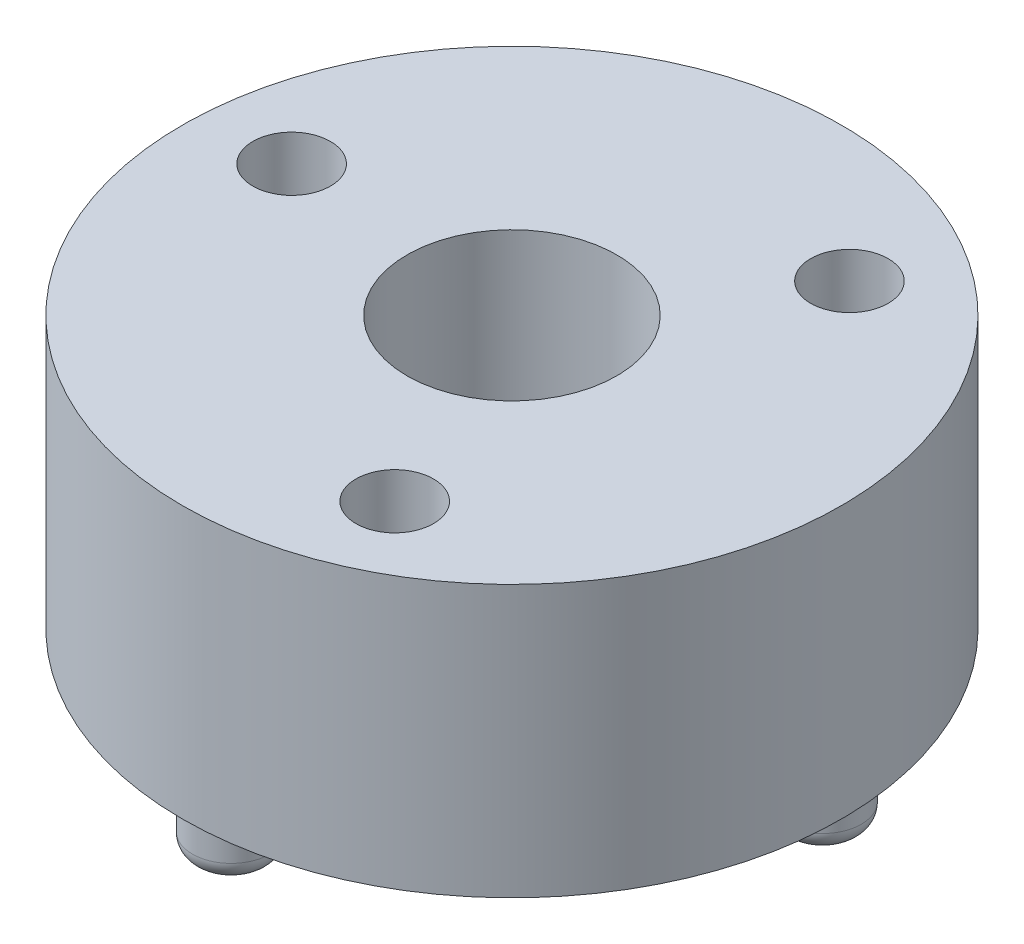
ISO-10303-21;
HEADER;
FILE_DESCRIPTION(('STEP AP214'),'2;1');
FILE_NAME('part.step','',(''),(''),'','','');
FILE_SCHEMA(('AUTOMOTIVE_DESIGN { 1 0 10303 214 1 1 1 1 }'));
ENDSEC;
DATA;
#1=APPLICATION_CONTEXT('core data for automotive mechanical design processes');
#2=APPLICATION_PROTOCOL_DEFINITION('international standard','automotive_design',2000,#1);
#3=PRODUCT_CONTEXT('',#1,'mechanical');
#4=PRODUCT('Part','Part','',(#3));
#5=PRODUCT_RELATED_PRODUCT_CATEGORY('part','',(#4));
#6=PRODUCT_DEFINITION_FORMATION('','',#4);
#7=PRODUCT_DEFINITION_CONTEXT('part definition',#1,'design');
#8=PRODUCT_DEFINITION('design','',#6,#7);
#9=PRODUCT_DEFINITION_SHAPE('','',#8);
#10=(LENGTH_UNIT() NAMED_UNIT(*) SI_UNIT(.MILLI.,.METRE.));
#11=(NAMED_UNIT(*) PLANE_ANGLE_UNIT() SI_UNIT($,.RADIAN.));
#12=(NAMED_UNIT(*) SI_UNIT($,.STERADIAN.) SOLID_ANGLE_UNIT());
#13=UNCERTAINTY_MEASURE_WITH_UNIT(LENGTH_MEASURE(1.E-05),#10,'distance_accuracy_value','');
#14=(GEOMETRIC_REPRESENTATION_CONTEXT(3) GLOBAL_UNCERTAINTY_ASSIGNED_CONTEXT((#13)) GLOBAL_UNIT_ASSIGNED_CONTEXT((#10,
#11,#12)) REPRESENTATION_CONTEXT('',''));
#15=CARTESIAN_POINT('',(0.,0.,0.));
#16=DIRECTION('',(0.,0.,1.));
#17=DIRECTION('',(1.,0.,0.));
#18=AXIS2_PLACEMENT_3D('',#15,#16,#17);
#19=CARTESIAN_POINT('',(0.,7.,0.));
#20=DIRECTION('',(0.,-1.,0.));
#21=DIRECTION('',(0.,0.,-1.));
#22=AXIS2_PLACEMENT_3D('',#19,#20,#21);
#23=CYLINDRICAL_SURFACE('',#22,8.5);
#24=CARTESIAN_POINT('',(0.,7.,0.));
#25=DIRECTION('',(0.,1.,0.));
#26=DIRECTION('',(0.,0.,1.));
#27=AXIS2_PLACEMENT_3D('',#24,#25,#26);
#28=CIRCLE('',#27,8.5);
#29=CARTESIAN_POINT('',(0.,7.,8.5));
#30=VERTEX_POINT('',#29);
#31=EDGE_CURVE('E57',#30,#30,#28,.T.);
#32=ORIENTED_EDGE('',*,*,#31,.F.);
#33=EDGE_LOOP('',(#32));
#34=FACE_BOUND('',#33,.T.);
#35=CARTESIAN_POINT('',(0.,0.,0.));
#36=DIRECTION('',(0.,1.,0.));
#37=DIRECTION('',(0.,0.,1.));
#38=AXIS2_PLACEMENT_3D('',#35,#36,#37);
#39=CIRCLE('',#38,8.5);
#40=CARTESIAN_POINT('',(0.,0.,8.5));
#41=VERTEX_POINT('',#40);
#42=EDGE_CURVE('E58',#41,#41,#39,.T.);
#43=ORIENTED_EDGE('',*,*,#42,.T.);
#44=EDGE_LOOP('',(#43));
#45=FACE_BOUND('',#44,.T.);
#46=ADVANCED_FACE('F31',(#34,#45),#23,.T.);
#47=CARTESIAN_POINT('',(0.,7.,0.));
#48=DIRECTION('',(0.,1.,0.));
#49=DIRECTION('',(0.,0.,1.));
#50=AXIS2_PLACEMENT_3D('',#47,#48,#49);
#51=PLANE('',#50);
#52=CARTESIAN_POINT('',(3.58485272719398,7.,-5.11970027680625));
#53=DIRECTION('',(0.,-1.,0.));
#54=DIRECTION('',(0.,0.,-1.));
#55=AXIS2_PLACEMENT_3D('',#52,#53,#54);
#56=CIRCLE('',#55,0.999999999999999);
#57=CARTESIAN_POINT('',(3.58485272719398,7.,-6.11970027680625));
#58=VERTEX_POINT('',#57);
#59=EDGE_CURVE('E79',#58,#58,#56,.T.);
#60=ORIENTED_EDGE('',*,*,#59,.T.);
#61=EDGE_LOOP('',(#60));
#62=FACE_BOUND('',#61,.T.);
#63=CARTESIAN_POINT('',(2.64136413587942,7.,5.66442366897904));
#64=DIRECTION('',(0.,-1.,0.));
#65=DIRECTION('',(0.,0.,-1.));
#66=AXIS2_PLACEMENT_3D('',#63,#64,#65);
#67=CIRCLE('',#66,1.);
#68=CARTESIAN_POINT('',(2.64136413587942,7.,4.66442366897904));
#69=VERTEX_POINT('',#68);
#70=EDGE_CURVE('E73',#69,#69,#67,.T.);
#71=ORIENTED_EDGE('',*,*,#70,.T.);
#72=EDGE_LOOP('',(#71));
#73=FACE_BOUND('',#72,.T.);
#74=CARTESIAN_POINT('',(-6.22621686307341,7.,-0.544723392172844));
#75=DIRECTION('',(0.,-1.,0.));
#76=DIRECTION('',(0.,0.,-1.));
#77=AXIS2_PLACEMENT_3D('',#74,#75,#76);
#78=CIRCLE('',#77,1.);
#79=CARTESIAN_POINT('',(-6.22621686307341,7.,-1.54472339217284));
#80=VERTEX_POINT('',#79);
#81=EDGE_CURVE('E67',#80,#80,#78,.T.);
#82=ORIENTED_EDGE('',*,*,#81,.T.);
#83=EDGE_LOOP('',(#82));
#84=FACE_BOUND('',#83,.T.);
#85=CARTESIAN_POINT('',(0.,7.,0.));
#86=DIRECTION('',(0.,1.,0.));
#87=DIRECTION('',(0.,0.,1.));
#88=AXIS2_PLACEMENT_3D('',#85,#86,#87);
#89=CIRCLE('',#88,2.705);
#90=CARTESIAN_POINT('',(0.,7.,2.705));
#91=VERTEX_POINT('',#90);
#92=EDGE_CURVE('E64',#91,#91,#89,.T.);
#93=ORIENTED_EDGE('',*,*,#92,.F.);
#94=EDGE_LOOP('',(#93));
#95=FACE_BOUND('',#94,.T.);
#96=ORIENTED_EDGE('',*,*,#31,.T.);
#97=EDGE_LOOP('',(#96));
#98=FACE_BOUND('',#97,.T.);
#99=ADVANCED_FACE('F88',(#62,#73,#84,#95,#98),#51,.T.);
#100=CARTESIAN_POINT('',(0.,0.,0.));
#101=DIRECTION('',(0.,1.,0.));
#102=DIRECTION('',(0.,0.,1.));
#103=AXIS2_PLACEMENT_3D('',#100,#101,#102);
#104=PLANE('',#103);
#105=CARTESIAN_POINT('',(3.58485272719398,0.,-5.11970027680625));
#106=DIRECTION('',(0.,-1.,0.));
#107=DIRECTION('',(0.,0.,-1.));
#108=AXIS2_PLACEMENT_3D('',#105,#106,#107);
#109=CIRCLE('',#108,0.999999999999999);
#110=CARTESIAN_POINT('',(3.58485272719398,0.,-6.11970027680625));
#111=VERTEX_POINT('',#110);
#112=EDGE_CURVE('E82',#111,#111,#109,.T.);
#113=ORIENTED_EDGE('',*,*,#112,.F.);
#114=EDGE_LOOP('',(#113));
#115=FACE_BOUND('',#114,.T.);
#116=CARTESIAN_POINT('',(2.64136413587942,0.,5.66442366897904));
#117=DIRECTION('',(0.,-1.,0.));
#118=DIRECTION('',(0.,0.,-1.));
#119=AXIS2_PLACEMENT_3D('',#116,#117,#118);
#120=CIRCLE('',#119,1.);
#121=CARTESIAN_POINT('',(2.64136413587942,0.,4.66442366897904));
#122=VERTEX_POINT('',#121);
#123=EDGE_CURVE('E76',#122,#122,#120,.T.);
#124=ORIENTED_EDGE('',*,*,#123,.F.);
#125=EDGE_LOOP('',(#124));
#126=FACE_BOUND('',#125,.T.);
#127=CARTESIAN_POINT('',(-6.22621686307341,0.,-0.544723392172844));
#128=DIRECTION('',(0.,-1.,0.));
#129=DIRECTION('',(0.,0.,-1.));
#130=AXIS2_PLACEMENT_3D('',#127,#128,#129);
#131=CIRCLE('',#130,1.);
#132=CARTESIAN_POINT('',(-6.22621686307341,0.,-1.54472339217284));
#133=VERTEX_POINT('',#132);
#134=EDGE_CURVE('E70',#133,#133,#131,.T.);
#135=ORIENTED_EDGE('',*,*,#134,.F.);
#136=EDGE_LOOP('',(#135));
#137=FACE_BOUND('',#136,.T.);
#138=CARTESIAN_POINT('',(5.87307887991229,0.,-2.13762589578513));
#139=DIRECTION('',(0.,1.,0.));
#140=DIRECTION('',(0.,0.,1.));
#141=AXIS2_PLACEMENT_3D('',#138,#139,#140);
#142=CIRCLE('',#141,1.00000000000035);
#143=CARTESIAN_POINT('',(5.87307887991229,0.,-1.13762589578478));
#144=VERTEX_POINT('',#143);
#145=EDGE_CURVE('E51',#144,#144,#142,.F.);
#146=ORIENTED_EDGE('',*,*,#145,.F.);
#147=EDGE_LOOP('',(#146));
#148=FACE_BOUND('',#147,.T.);
#149=CARTESIAN_POINT('',(-1.08530111041832,0.,6.15504845632631));
#150=DIRECTION('',(0.,1.,0.));
#151=DIRECTION('',(0.,0.,1.));
#152=AXIS2_PLACEMENT_3D('',#149,#150,#151);
#153=CIRCLE('',#152,1.);
#154=CARTESIAN_POINT('',(-1.08530111041832,0.,7.15504845632631));
#155=VERTEX_POINT('',#154);
#156=EDGE_CURVE('E54',#155,#155,#153,.F.);
#157=ORIENTED_EDGE('',*,*,#156,.F.);
#158=EDGE_LOOP('',(#157));
#159=FACE_BOUND('',#158,.T.);
#160=ORIENTED_EDGE('',*,*,#42,.F.);
#161=EDGE_LOOP('',(#160));
#162=FACE_BOUND('',#161,.T.);
#163=ADVANCED_FACE('F99',(#115,#126,#137,#148,#159,#162),#104,.F.);
#164=CARTESIAN_POINT('',(0.,2.,0.));
#165=DIRECTION('',(0.,1.,0.));
#166=DIRECTION('',(0.,0.,1.));
#167=AXIS2_PLACEMENT_3D('',#164,#165,#166);
#168=CYLINDRICAL_SURFACE('',#167,2.705);
#169=CARTESIAN_POINT('',(0.,2.,0.));
#170=DIRECTION('',(0.,1.,0.));
#171=DIRECTION('',(0.,0.,1.));
#172=AXIS2_PLACEMENT_3D('',#169,#170,#171);
#173=CIRCLE('',#172,2.705);
#174=CARTESIAN_POINT('',(0.,2.,2.705));
#175=VERTEX_POINT('',#174);
#176=EDGE_CURVE('E61',#175,#175,#173,.T.);
#177=ORIENTED_EDGE('',*,*,#176,.F.);
#178=EDGE_LOOP('',(#177));
#179=FACE_BOUND('',#178,.T.);
#180=ORIENTED_EDGE('',*,*,#92,.T.);
#181=EDGE_LOOP('',(#180));
#182=FACE_BOUND('',#181,.T.);
#183=ADVANCED_FACE('F102',(#179,#182),#168,.F.);
#184=CARTESIAN_POINT('',(0.,2.,0.));
#185=DIRECTION('',(0.,1.,0.));
#186=DIRECTION('',(0.,0.,1.));
#187=AXIS2_PLACEMENT_3D('',#184,#185,#186);
#188=PLANE('',#187);
#189=ORIENTED_EDGE('',*,*,#176,.T.);
#190=EDGE_LOOP('',(#189));
#191=FACE_BOUND('',#190,.T.);
#192=ADVANCED_FACE('F143',(#191),#188,.T.);
#193=CARTESIAN_POINT('',(-1.08530111041832,-2.5,6.15504845632631));
#194=DIRECTION('',(0.,1.,0.));
#195=DIRECTION('',(0.,0.,1.));
#196=AXIS2_PLACEMENT_3D('',#193,#194,#195);
#197=CYLINDRICAL_SURFACE('',#196,1.);
#198=CARTESIAN_POINT('',(-1.08530111041832,-2.,6.15504845632631));
#199=DIRECTION('',(0.,-1.,0.));
#200=DIRECTION('',(0.,0.,-1.));
#201=AXIS2_PLACEMENT_3D('',#198,#199,#200);
#202=CIRCLE('',#201,1.);
#203=CARTESIAN_POINT('',(-1.08530111041832,-2.,5.1550484563263));
#204=VERTEX_POINT('',#203);
#205=EDGE_CURVE('E42',#204,#204,#202,.F.);
#206=ORIENTED_EDGE('',*,*,#205,.T.);
#207=EDGE_LOOP('',(#206));
#208=FACE_BOUND('',#207,.T.);
#209=ORIENTED_EDGE('',*,*,#156,.T.);
#210=EDGE_LOOP('',(#209));
#211=FACE_BOUND('',#210,.T.);
#212=ADVANCED_FACE('F135',(#208,#211),#197,.T.);
#213=CARTESIAN_POINT('',(-1.08530111041832,-2.5,6.15504845632631));
#214=DIRECTION('',(0.,-1.,0.));
#215=DIRECTION('',(0.,0.,-1.));
#216=AXIS2_PLACEMENT_3D('',#213,#214,#215);
#217=PLANE('',#216);
#218=CARTESIAN_POINT('',(-1.08530111041832,-2.5,6.15504845632631));
#219=DIRECTION('',(0.,-1.,0.));
#220=DIRECTION('',(0.,0.,-1.));
#221=AXIS2_PLACEMENT_3D('',#218,#219,#220);
#222=CIRCLE('',#221,0.500000000000003);
#223=CARTESIAN_POINT('',(-1.08530111041832,-2.5,5.6550484563263));
#224=VERTEX_POINT('',#223);
#225=EDGE_CURVE('E46',#224,#224,#222,.T.);
#226=ORIENTED_EDGE('',*,*,#225,.T.);
#227=EDGE_LOOP('',(#226));
#228=FACE_BOUND('',#227,.T.);
#229=ADVANCED_FACE('F132',(#228),#217,.T.);
#230=CARTESIAN_POINT('',(5.87307887991229,-2.5,-2.13762589578513));
#231=DIRECTION('',(0.,1.,0.));
#232=DIRECTION('',(0.,0.,1.));
#233=AXIS2_PLACEMENT_3D('',#230,#231,#232);
#234=CYLINDRICAL_SURFACE('',#233,1.00000000000035);
#235=CARTESIAN_POINT('',(5.87307887991229,-2.,-2.13762589578513));
#236=DIRECTION('',(0.,-1.,0.));
#237=DIRECTION('',(0.,0.,-1.));
#238=AXIS2_PLACEMENT_3D('',#235,#236,#237);
#239=CIRCLE('',#238,1.00000000000035);
#240=CARTESIAN_POINT('',(5.87307887991229,-2.,-3.13762589578548));
#241=VERTEX_POINT('',#240);
#242=EDGE_CURVE('E10',#241,#241,#239,.F.);
#243=ORIENTED_EDGE('',*,*,#242,.T.);
#244=EDGE_LOOP('',(#243));
#245=FACE_BOUND('',#244,.T.);
#246=ORIENTED_EDGE('',*,*,#145,.T.);
#247=EDGE_LOOP('',(#246));
#248=FACE_BOUND('',#247,.T.);
#249=ADVANCED_FACE('F134',(#245,#248),#234,.T.);
#250=CARTESIAN_POINT('',(5.87307887991229,-2.5,-2.13762589578513));
#251=DIRECTION('',(0.,-1.,0.));
#252=DIRECTION('',(0.,0.,-1.));
#253=AXIS2_PLACEMENT_3D('',#250,#251,#252);
#254=PLANE('',#253);
#255=CARTESIAN_POINT('',(5.87307887991229,-2.5,-2.13762589578513));
#256=DIRECTION('',(0.,-1.,0.));
#257=DIRECTION('',(0.,0.,-1.));
#258=AXIS2_PLACEMENT_3D('',#255,#256,#257);
#259=CIRCLE('',#258,0.500000000000349);
#260=CARTESIAN_POINT('',(5.87307887991229,-2.5,-2.63762589578548));
#261=VERTEX_POINT('',#260);
#262=EDGE_CURVE('E38',#261,#261,#259,.T.);
#263=ORIENTED_EDGE('',*,*,#262,.T.);
#264=EDGE_LOOP('',(#263));
#265=FACE_BOUND('',#264,.T.);
#266=ADVANCED_FACE('F141',(#265),#254,.T.);
#267=CARTESIAN_POINT('',(-6.22621686307341,7.,-0.544723392172844));
#268=DIRECTION('',(0.,-1.,0.));
#269=DIRECTION('',(0.,0.,-1.));
#270=AXIS2_PLACEMENT_3D('',#267,#268,#269);
#271=CYLINDRICAL_SURFACE('',#270,1.);
#272=ORIENTED_EDGE('',*,*,#81,.F.);
#273=EDGE_LOOP('',(#272));
#274=FACE_BOUND('',#273,.T.);
#275=ORIENTED_EDGE('',*,*,#134,.T.);
#276=EDGE_LOOP('',(#275));
#277=FACE_BOUND('',#276,.T.);
#278=ADVANCED_FACE('F193',(#274,#277),#271,.F.);
#279=CARTESIAN_POINT('',(2.64136413587942,7.,5.66442366897904));
#280=DIRECTION('',(0.,-1.,0.));
#281=DIRECTION('',(0.,0.,-1.));
#282=AXIS2_PLACEMENT_3D('',#279,#280,#281);
#283=CYLINDRICAL_SURFACE('',#282,1.);
#284=ORIENTED_EDGE('',*,*,#70,.F.);
#285=EDGE_LOOP('',(#284));
#286=FACE_BOUND('',#285,.T.);
#287=ORIENTED_EDGE('',*,*,#123,.T.);
#288=EDGE_LOOP('',(#287));
#289=FACE_BOUND('',#288,.T.);
#290=ADVANCED_FACE('F95',(#286,#289),#283,.F.);
#291=CARTESIAN_POINT('',(3.58485272719398,7.,-5.11970027680625));
#292=DIRECTION('',(0.,-1.,0.));
#293=DIRECTION('',(0.,0.,-1.));
#294=AXIS2_PLACEMENT_3D('',#291,#292,#293);
#295=CYLINDRICAL_SURFACE('',#294,0.999999999999999);
#296=ORIENTED_EDGE('',*,*,#59,.F.);
#297=EDGE_LOOP('',(#296));
#298=FACE_BOUND('',#297,.T.);
#299=ORIENTED_EDGE('',*,*,#112,.T.);
#300=EDGE_LOOP('',(#299));
#301=FACE_BOUND('',#300,.T.);
#302=ADVANCED_FACE('F91',(#298,#301),#295,.F.);
#303=CARTESIAN_POINT('',(-1.08530111041832,-2.,6.15504845632631));
#304=DIRECTION('',(0.,-1.,0.));
#305=DIRECTION('',(0.,0.,-1.));
#306=AXIS2_PLACEMENT_3D('',#303,#304,#305);
#307=TOROIDAL_SURFACE('',#306,0.500000000000003,0.5);
#308=ORIENTED_EDGE('',*,*,#205,.F.);
#309=EDGE_LOOP('',(#308));
#310=FACE_BOUND('',#309,.T.);
#311=ORIENTED_EDGE('',*,*,#225,.F.);
#312=EDGE_LOOP('',(#311));
#313=FACE_BOUND('',#312,.T.);
#314=ADVANCED_FACE('F94',(#310,#313),#307,.T.);
#315=CARTESIAN_POINT('',(5.87307887991229,-2.,-2.13762589578513));
#316=DIRECTION('',(0.,-1.,0.));
#317=DIRECTION('',(0.,0.,-1.));
#318=AXIS2_PLACEMENT_3D('',#315,#316,#317);
#319=TOROIDAL_SURFACE('',#318,0.500000000000349,0.5);
#320=ORIENTED_EDGE('',*,*,#242,.F.);
#321=EDGE_LOOP('',(#320));
#322=FACE_BOUND('',#321,.T.);
#323=ORIENTED_EDGE('',*,*,#262,.F.);
#324=EDGE_LOOP('',(#323));
#325=FACE_BOUND('',#324,.T.);
#326=ADVANCED_FACE('F33',(#322,#325),#319,.T.);
#327=CLOSED_SHELL('',(#46,#99,#163,#183,#192,#212,#229,#249,#266,#278,#290,#302,#314,#326));
#328=MANIFOLD_SOLID_BREP('B2',#327);
#329=ADVANCED_BREP_SHAPE_REPRESENTATION('',(#18,#328),#14);
#330=SHAPE_DEFINITION_REPRESENTATION(#9,#329);
ENDSEC;
END-ISO-10303-21;
